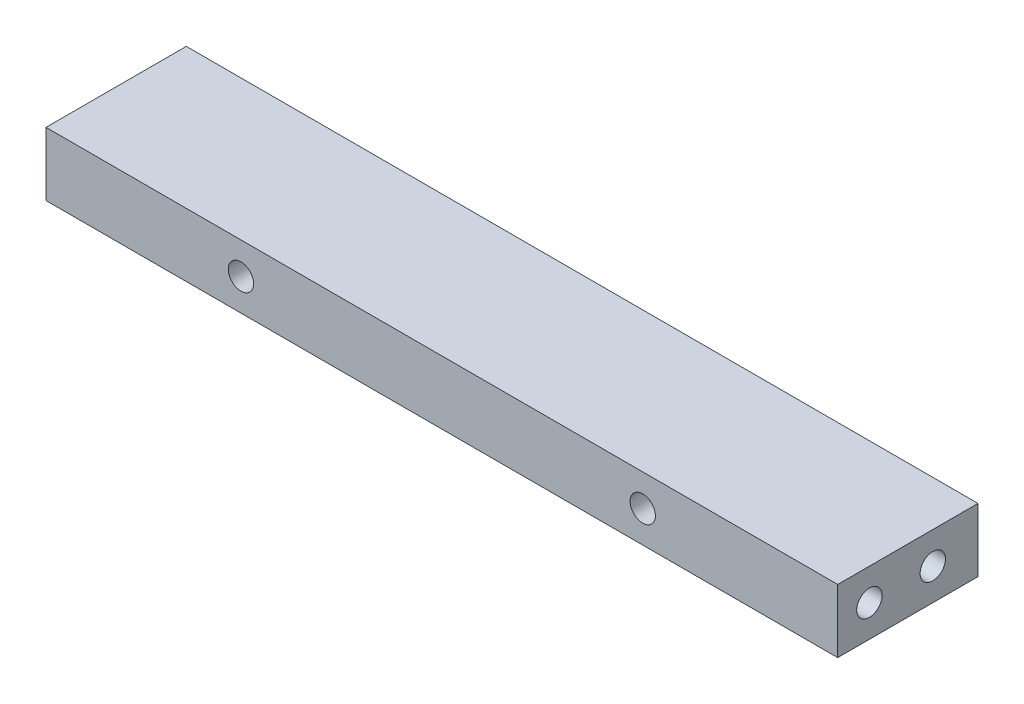
ISO-10303-21;
HEADER;
FILE_DESCRIPTION(('STEP AP214'),'2;1');
FILE_NAME('part.step','',(''),(''),'','','');
FILE_SCHEMA(('AUTOMOTIVE_DESIGN { 1 0 10303 214 1 1 1 1 }'));
ENDSEC;
DATA;
#1=APPLICATION_CONTEXT('core data for automotive mechanical design processes');
#2=APPLICATION_PROTOCOL_DEFINITION('international standard','automotive_design',2000,#1);
#3=PRODUCT_CONTEXT('',#1,'mechanical');
#4=PRODUCT('Part','Part','',(#3));
#5=PRODUCT_RELATED_PRODUCT_CATEGORY('part','',(#4));
#6=PRODUCT_DEFINITION_FORMATION('','',#4);
#7=PRODUCT_DEFINITION_CONTEXT('part definition',#1,'design');
#8=PRODUCT_DEFINITION('design','',#6,#7);
#9=PRODUCT_DEFINITION_SHAPE('','',#8);
#10=(LENGTH_UNIT() NAMED_UNIT(*) SI_UNIT(.MILLI.,.METRE.));
#11=(NAMED_UNIT(*) PLANE_ANGLE_UNIT() SI_UNIT($,.RADIAN.));
#12=(NAMED_UNIT(*) SI_UNIT($,.STERADIAN.) SOLID_ANGLE_UNIT());
#13=UNCERTAINTY_MEASURE_WITH_UNIT(LENGTH_MEASURE(1.E-05),#10,'distance_accuracy_value','');
#14=(GEOMETRIC_REPRESENTATION_CONTEXT(3) GLOBAL_UNCERTAINTY_ASSIGNED_CONTEXT((#13)) GLOBAL_UNIT_ASSIGNED_CONTEXT((#10,
#11,#12)) REPRESENTATION_CONTEXT('',''));
#15=CARTESIAN_POINT('',(0.,0.,0.));
#16=DIRECTION('',(0.,0.,1.));
#17=DIRECTION('',(1.,0.,0.));
#18=AXIS2_PLACEMENT_3D('',#15,#16,#17);
#19=CARTESIAN_POINT('',(-0.3,-4.3,11.1));
#20=DIRECTION('',(1.,0.,0.));
#21=DIRECTION('',(0.,0.,-1.));
#22=AXIS2_PLACEMENT_3D('',#19,#20,#21);
#23=PLANE('',#22);
#24=CARTESIAN_POINT('',(-0.3,-2.3,5.1));
#25=DIRECTION('',(-1.,0.,0.));
#26=DIRECTION('',(0.,0.,1.));
#27=AXIS2_PLACEMENT_3D('',#24,#25,#26);
#28=CIRCLE('',#27,0.8);
#29=CARTESIAN_POINT('',(-0.3,-2.3,5.9));
#30=VERTEX_POINT('',#29);
#31=EDGE_CURVE('E165',#30,#30,#28,.T.);
#32=ORIENTED_EDGE('',*,*,#31,.F.);
#33=EDGE_LOOP('',(#32));
#34=FACE_BOUND('',#33,.T.);
#35=CARTESIAN_POINT('',(-0.3,-2.3,9.1));
#36=DIRECTION('',(-1.,0.,0.));
#37=DIRECTION('',(0.,0.,1.));
#38=AXIS2_PLACEMENT_3D('',#35,#36,#37);
#39=CIRCLE('',#38,0.8);
#40=CARTESIAN_POINT('',(-0.3,-2.3,9.9));
#41=VERTEX_POINT('',#40);
#42=EDGE_CURVE('E160',#41,#41,#39,.T.);
#43=ORIENTED_EDGE('',*,*,#42,.F.);
#44=EDGE_LOOP('',(#43));
#45=FACE_BOUND('',#44,.T.);
#46=DIRECTION('',(0.,-1.,0.));
#47=VECTOR('',#46,1.);
#48=CARTESIAN_POINT('',(-0.3,-4.3,2.248090434488));
#49=LINE('',#48,#47);
#50=CARTESIAN_POINT('',(-0.3,-0.3,2.248090434488));
#51=VERTEX_POINT('',#50);
#52=CARTESIAN_POINT('',(-0.3,-4.3,2.248090434488));
#53=VERTEX_POINT('',#52);
#54=EDGE_CURVE('E119',#51,#53,#49,.T.);
#55=ORIENTED_EDGE('',*,*,#54,.T.);
#56=DIRECTION('',(0.,0.,-1.));
#57=VECTOR('',#56,1.);
#58=CARTESIAN_POINT('',(-0.3,-4.3,11.1));
#59=LINE('',#58,#57);
#60=CARTESIAN_POINT('',(-0.3,-4.3,11.1));
#61=VERTEX_POINT('',#60);
#62=EDGE_CURVE('E11',#61,#53,#59,.T.);
#63=ORIENTED_EDGE('',*,*,#62,.F.);
#64=DIRECTION('',(0.,-1.,0.));
#65=VECTOR('',#64,1.);
#66=CARTESIAN_POINT('',(-0.3,-4.3,11.1));
#67=LINE('',#66,#65);
#68=CARTESIAN_POINT('',(-0.3,-0.3,11.1));
#69=VERTEX_POINT('',#68);
#70=EDGE_CURVE('E101',#69,#61,#67,.T.);
#71=ORIENTED_EDGE('',*,*,#70,.F.);
#72=DIRECTION('',(0.,0.,-1.));
#73=VECTOR('',#72,1.);
#74=CARTESIAN_POINT('',(-0.3,-0.3,11.1));
#75=LINE('',#74,#73);
#76=EDGE_CURVE('E115',#69,#51,#75,.T.);
#77=ORIENTED_EDGE('',*,*,#76,.T.);
#78=EDGE_LOOP('',(#55,#63,#71,#77));
#79=FACE_BOUND('',#78,.T.);
#80=ADVANCED_FACE('F49',(#34,#45,#79),#23,.F.);
#81=CARTESIAN_POINT('',(-0.3,-4.3,11.1));
#82=DIRECTION('',(0.,1.,0.));
#83=DIRECTION('',(0.,0.,1.));
#84=AXIS2_PLACEMENT_3D('',#81,#82,#83);
#85=PLANE('',#84);
#86=DIRECTION('',(1.,0.,0.));
#87=VECTOR('',#86,1.);
#88=CARTESIAN_POINT('',(-0.3,-4.3,2.248090434488));
#89=LINE('',#88,#87);
#90=CARTESIAN_POINT('',(49.65,-4.3,2.248090434488));
#91=VERTEX_POINT('',#90);
#92=EDGE_CURVE('E106',#53,#91,#89,.T.);
#93=ORIENTED_EDGE('',*,*,#92,.T.);
#94=DIRECTION('',(0.,0.,-1.));
#95=VECTOR('',#94,1.);
#96=CARTESIAN_POINT('',(49.65,-4.3,11.1));
#97=LINE('',#96,#95);
#98=CARTESIAN_POINT('',(49.65,-4.3,11.1));
#99=VERTEX_POINT('',#98);
#100=EDGE_CURVE('E58',#99,#91,#97,.T.);
#101=ORIENTED_EDGE('',*,*,#100,.F.);
#102=DIRECTION('',(1.,0.,0.));
#103=VECTOR('',#102,1.);
#104=CARTESIAN_POINT('',(-0.3,-4.3,11.1));
#105=LINE('',#104,#103);
#106=EDGE_CURVE('E96',#61,#99,#105,.T.);
#107=ORIENTED_EDGE('',*,*,#106,.F.);
#108=ORIENTED_EDGE('',*,*,#62,.T.);
#109=EDGE_LOOP('',(#93,#101,#107,#108));
#110=FACE_BOUND('',#109,.T.);
#111=ADVANCED_FACE('F105',(#110),#85,.F.);
#112=CARTESIAN_POINT('',(49.65,-4.3,11.1));
#113=DIRECTION('',(-1.,0.,0.));
#114=DIRECTION('',(0.,0.,1.));
#115=AXIS2_PLACEMENT_3D('',#112,#113,#114);
#116=PLANE('',#115);
#117=CARTESIAN_POINT('',(49.65,-2.3,5.1));
#118=DIRECTION('',(1.,0.,0.));
#119=DIRECTION('',(0.,0.,-1.));
#120=AXIS2_PLACEMENT_3D('',#117,#118,#119);
#121=CIRCLE('',#120,0.8);
#122=CARTESIAN_POINT('',(49.65,-2.3,4.3));
#123=VERTEX_POINT('',#122);
#124=EDGE_CURVE('E179',#123,#123,#121,.T.);
#125=ORIENTED_EDGE('',*,*,#124,.F.);
#126=EDGE_LOOP('',(#125));
#127=FACE_BOUND('',#126,.T.);
#128=CARTESIAN_POINT('',(49.65,-2.3,9.1));
#129=DIRECTION('',(1.,0.,0.));
#130=DIRECTION('',(0.,0.,-1.));
#131=AXIS2_PLACEMENT_3D('',#128,#129,#130);
#132=CIRCLE('',#131,0.8);
#133=CARTESIAN_POINT('',(49.65,-2.3,8.3));
#134=VERTEX_POINT('',#133);
#135=EDGE_CURVE('E176',#134,#134,#132,.T.);
#136=ORIENTED_EDGE('',*,*,#135,.F.);
#137=EDGE_LOOP('',(#136));
#138=FACE_BOUND('',#137,.T.);
#139=DIRECTION('',(0.,1.,0.));
#140=VECTOR('',#139,1.);
#141=CARTESIAN_POINT('',(49.65,-4.3,2.248090434488));
#142=LINE('',#141,#140);
#143=CARTESIAN_POINT('',(49.65,-0.3,2.248090434488));
#144=VERTEX_POINT('',#143);
#145=EDGE_CURVE('E83',#91,#144,#142,.T.);
#146=ORIENTED_EDGE('',*,*,#145,.T.);
#147=DIRECTION('',(0.,0.,-1.));
#148=VECTOR('',#147,1.);
#149=CARTESIAN_POINT('',(49.65,-0.3,11.1));
#150=LINE('',#149,#148);
#151=CARTESIAN_POINT('',(49.65,-0.3,11.1));
#152=VERTEX_POINT('',#151);
#153=EDGE_CURVE('E108',#152,#144,#150,.T.);
#154=ORIENTED_EDGE('',*,*,#153,.F.);
#155=DIRECTION('',(0.,1.,0.));
#156=VECTOR('',#155,1.);
#157=CARTESIAN_POINT('',(49.65,-4.3,11.1));
#158=LINE('',#157,#156);
#159=EDGE_CURVE('E99',#99,#152,#158,.T.);
#160=ORIENTED_EDGE('',*,*,#159,.F.);
#161=ORIENTED_EDGE('',*,*,#100,.T.);
#162=EDGE_LOOP('',(#146,#154,#160,#161));
#163=FACE_BOUND('',#162,.T.);
#164=ADVANCED_FACE('F109',(#127,#138,#163),#116,.F.);
#165=CARTESIAN_POINT('',(-0.3,-0.3,11.1));
#166=DIRECTION('',(0.,-1.,0.));
#167=DIRECTION('',(0.,0.,-1.));
#168=AXIS2_PLACEMENT_3D('',#165,#166,#167);
#169=PLANE('',#168);
#170=DIRECTION('',(-1.,0.,0.));
#171=VECTOR('',#170,1.);
#172=CARTESIAN_POINT('',(-0.3,-0.3,2.248090434488));
#173=LINE('',#172,#171);
#174=EDGE_CURVE('E89',#144,#51,#173,.T.);
#175=ORIENTED_EDGE('',*,*,#174,.T.);
#176=ORIENTED_EDGE('',*,*,#76,.F.);
#177=DIRECTION('',(-1.,0.,0.));
#178=VECTOR('',#177,1.);
#179=CARTESIAN_POINT('',(-0.3,-0.3,11.1));
#180=LINE('',#179,#178);
#181=EDGE_CURVE('E66',#152,#69,#180,.T.);
#182=ORIENTED_EDGE('',*,*,#181,.F.);
#183=ORIENTED_EDGE('',*,*,#153,.T.);
#184=EDGE_LOOP('',(#175,#176,#182,#183));
#185=FACE_BOUND('',#184,.T.);
#186=ADVANCED_FACE('F133',(#185),#169,.F.);
#187=CARTESIAN_POINT('',(0.,0.,11.1));
#188=DIRECTION('',(0.,0.,-1.));
#189=DIRECTION('',(-1.,0.,0.));
#190=AXIS2_PLACEMENT_3D('',#187,#188,#189);
#191=PLANE('',#190);
#192=CARTESIAN_POINT('',(12.,-2.3,11.1));
#193=DIRECTION('',(0.,0.,1.));
#194=DIRECTION('',(1.,0.,0.));
#195=AXIS2_PLACEMENT_3D('',#192,#193,#194);
#196=CIRCLE('',#195,0.8);
#197=CARTESIAN_POINT('',(12.8,-2.3,11.1));
#198=VERTEX_POINT('',#197);
#199=EDGE_CURVE('E150',#198,#198,#196,.T.);
#200=ORIENTED_EDGE('',*,*,#199,.F.);
#201=EDGE_LOOP('',(#200));
#202=FACE_BOUND('',#201,.T.);
#203=CARTESIAN_POINT('',(37.35,-2.3,11.1));
#204=DIRECTION('',(0.,0.,1.));
#205=DIRECTION('',(1.,0.,0.));
#206=AXIS2_PLACEMENT_3D('',#203,#204,#205);
#207=CIRCLE('',#206,0.800000000000002);
#208=CARTESIAN_POINT('',(38.15,-2.3,11.1));
#209=VERTEX_POINT('',#208);
#210=EDGE_CURVE('E145',#209,#209,#207,.T.);
#211=ORIENTED_EDGE('',*,*,#210,.F.);
#212=EDGE_LOOP('',(#211));
#213=FACE_BOUND('',#212,.T.);
#214=ORIENTED_EDGE('',*,*,#70,.T.);
#215=ORIENTED_EDGE('',*,*,#106,.T.);
#216=ORIENTED_EDGE('',*,*,#159,.T.);
#217=ORIENTED_EDGE('',*,*,#181,.T.);
#218=EDGE_LOOP('',(#214,#215,#216,#217));
#219=FACE_BOUND('',#218,.T.);
#220=ADVANCED_FACE('F97',(#202,#213,#219),#191,.F.);
#221=CARTESIAN_POINT('',(0.,0.,2.248090434488));
#222=DIRECTION('',(0.,0.,-1.));
#223=DIRECTION('',(-1.,0.,0.));
#224=AXIS2_PLACEMENT_3D('',#221,#222,#223);
#225=PLANE('',#224);
#226=CARTESIAN_POINT('',(12.,-2.3,2.248090434488));
#227=DIRECTION('',(0.,0.,1.));
#228=DIRECTION('',(1.,0.,0.));
#229=AXIS2_PLACEMENT_3D('',#226,#227,#228);
#230=CIRCLE('',#229,0.8);
#231=CARTESIAN_POINT('',(12.8,-2.3,2.248090434488));
#232=VERTEX_POINT('',#231);
#233=EDGE_CURVE('E123',#232,#232,#230,.T.);
#234=ORIENTED_EDGE('',*,*,#233,.T.);
#235=EDGE_LOOP('',(#234));
#236=FACE_BOUND('',#235,.T.);
#237=CARTESIAN_POINT('',(37.35,-2.3,2.248090434488));
#238=DIRECTION('',(0.,0.,1.));
#239=DIRECTION('',(1.,0.,0.));
#240=AXIS2_PLACEMENT_3D('',#237,#238,#239);
#241=CIRCLE('',#240,0.800000000000002);
#242=CARTESIAN_POINT('',(38.15,-2.3,2.248090434488));
#243=VERTEX_POINT('',#242);
#244=EDGE_CURVE('E141',#243,#243,#241,.T.);
#245=ORIENTED_EDGE('',*,*,#244,.T.);
#246=EDGE_LOOP('',(#245));
#247=FACE_BOUND('',#246,.T.);
#248=ORIENTED_EDGE('',*,*,#54,.F.);
#249=ORIENTED_EDGE('',*,*,#174,.F.);
#250=ORIENTED_EDGE('',*,*,#145,.F.);
#251=ORIENTED_EDGE('',*,*,#92,.F.);
#252=EDGE_LOOP('',(#248,#249,#250,#251));
#253=FACE_BOUND('',#252,.T.);
#254=ADVANCED_FACE('F136',(#236,#247,#253),#225,.T.);
#255=CARTESIAN_POINT('',(37.35,-2.3,2.248090434488));
#256=DIRECTION('',(0.,0.,1.));
#257=DIRECTION('',(1.,0.,0.));
#258=AXIS2_PLACEMENT_3D('',#255,#256,#257);
#259=CYLINDRICAL_SURFACE('',#258,0.800000000000002);
#260=ORIENTED_EDGE('',*,*,#244,.F.);
#261=EDGE_LOOP('',(#260));
#262=FACE_BOUND('',#261,.T.);
#263=ORIENTED_EDGE('',*,*,#210,.T.);
#264=EDGE_LOOP('',(#263));
#265=FACE_BOUND('',#264,.T.);
#266=ADVANCED_FACE('F233',(#262,#265),#259,.F.);
#267=CARTESIAN_POINT('',(12.,-2.3,2.248090434488));
#268=DIRECTION('',(0.,0.,1.));
#269=DIRECTION('',(1.,0.,0.));
#270=AXIS2_PLACEMENT_3D('',#267,#268,#269);
#271=CYLINDRICAL_SURFACE('',#270,0.8);
#272=ORIENTED_EDGE('',*,*,#233,.F.);
#273=EDGE_LOOP('',(#272));
#274=FACE_BOUND('',#273,.T.);
#275=ORIENTED_EDGE('',*,*,#199,.T.);
#276=EDGE_LOOP('',(#275));
#277=FACE_BOUND('',#276,.T.);
#278=ADVANCED_FACE('F225',(#274,#277),#271,.F.);
#279=CARTESIAN_POINT('',(4.7,-2.3,9.1));
#280=DIRECTION('',(-1.,0.,0.));
#281=DIRECTION('',(0.,0.,1.));
#282=AXIS2_PLACEMENT_3D('',#279,#280,#281);
#283=CYLINDRICAL_SURFACE('',#282,0.8);
#284=CARTESIAN_POINT('',(4.7,-2.3,9.1));
#285=DIRECTION('',(-1.,0.,0.));
#286=DIRECTION('',(0.,0.,1.));
#287=AXIS2_PLACEMENT_3D('',#284,#285,#286);
#288=CIRCLE('',#287,0.8);
#289=CARTESIAN_POINT('',(4.7,-2.3,9.9));
#290=VERTEX_POINT('',#289);
#291=EDGE_CURVE('E156',#290,#290,#288,.T.);
#292=ORIENTED_EDGE('',*,*,#291,.F.);
#293=EDGE_LOOP('',(#292));
#294=FACE_BOUND('',#293,.T.);
#295=ORIENTED_EDGE('',*,*,#42,.T.);
#296=EDGE_LOOP('',(#295));
#297=FACE_BOUND('',#296,.T.);
#298=ADVANCED_FACE('F222',(#294,#297),#283,.F.);
#299=CARTESIAN_POINT('',(4.7,-2.3,9.1));
#300=DIRECTION('',(-1.,0.,0.));
#301=DIRECTION('',(0.,0.,1.));
#302=AXIS2_PLACEMENT_3D('',#299,#300,#301);
#303=PLANE('',#302);
#304=ORIENTED_EDGE('',*,*,#291,.T.);
#305=EDGE_LOOP('',(#304));
#306=FACE_BOUND('',#305,.T.);
#307=ADVANCED_FACE('F224',(#306),#303,.T.);
#308=CARTESIAN_POINT('',(4.7,-2.3,5.1));
#309=DIRECTION('',(-1.,0.,0.));
#310=DIRECTION('',(0.,0.,1.));
#311=AXIS2_PLACEMENT_3D('',#308,#309,#310);
#312=CYLINDRICAL_SURFACE('',#311,0.8);
#313=CARTESIAN_POINT('',(4.7,-2.3,5.1));
#314=DIRECTION('',(-1.,0.,0.));
#315=DIRECTION('',(0.,0.,1.));
#316=AXIS2_PLACEMENT_3D('',#313,#314,#315);
#317=CIRCLE('',#316,0.8);
#318=CARTESIAN_POINT('',(4.7,-2.3,5.9));
#319=VERTEX_POINT('',#318);
#320=EDGE_CURVE('E146',#319,#319,#317,.T.);
#321=ORIENTED_EDGE('',*,*,#320,.F.);
#322=EDGE_LOOP('',(#321));
#323=FACE_BOUND('',#322,.T.);
#324=ORIENTED_EDGE('',*,*,#31,.T.);
#325=EDGE_LOOP('',(#324));
#326=FACE_BOUND('',#325,.T.);
#327=ADVANCED_FACE('F210',(#323,#326),#312,.F.);
#328=CARTESIAN_POINT('',(4.7,-2.3,5.1));
#329=DIRECTION('',(-1.,0.,0.));
#330=DIRECTION('',(0.,0.,1.));
#331=AXIS2_PLACEMENT_3D('',#328,#329,#330);
#332=PLANE('',#331);
#333=ORIENTED_EDGE('',*,*,#320,.T.);
#334=EDGE_LOOP('',(#333));
#335=FACE_BOUND('',#334,.T.);
#336=ADVANCED_FACE('F202',(#335),#332,.T.);
#337=CARTESIAN_POINT('',(44.65,-2.3,9.1));
#338=DIRECTION('',(1.,0.,0.));
#339=DIRECTION('',(0.,0.,-1.));
#340=AXIS2_PLACEMENT_3D('',#337,#338,#339);
#341=CYLINDRICAL_SURFACE('',#340,0.8);
#342=CARTESIAN_POINT('',(44.65,-2.3,9.1));
#343=DIRECTION('',(1.,0.,0.));
#344=DIRECTION('',(0.,0.,-1.));
#345=AXIS2_PLACEMENT_3D('',#342,#343,#344);
#346=CIRCLE('',#345,0.8);
#347=CARTESIAN_POINT('',(44.65,-2.3,8.3));
#348=VERTEX_POINT('',#347);
#349=EDGE_CURVE('E172',#348,#348,#346,.T.);
#350=ORIENTED_EDGE('',*,*,#349,.F.);
#351=EDGE_LOOP('',(#350));
#352=FACE_BOUND('',#351,.T.);
#353=ORIENTED_EDGE('',*,*,#135,.T.);
#354=EDGE_LOOP('',(#353));
#355=FACE_BOUND('',#354,.T.);
#356=ADVANCED_FACE('F200',(#352,#355),#341,.F.);
#357=CARTESIAN_POINT('',(44.65,-2.3,9.1));
#358=DIRECTION('',(1.,0.,0.));
#359=DIRECTION('',(0.,0.,-1.));
#360=AXIS2_PLACEMENT_3D('',#357,#358,#359);
#361=PLANE('',#360);
#362=ORIENTED_EDGE('',*,*,#349,.T.);
#363=EDGE_LOOP('',(#362));
#364=FACE_BOUND('',#363,.T.);
#365=ADVANCED_FACE('F191',(#364),#361,.T.);
#366=CARTESIAN_POINT('',(44.65,-2.3,5.1));
#367=DIRECTION('',(1.,0.,0.));
#368=DIRECTION('',(0.,0.,-1.));
#369=AXIS2_PLACEMENT_3D('',#366,#367,#368);
#370=CYLINDRICAL_SURFACE('',#369,0.8);
#371=CARTESIAN_POINT('',(44.65,-2.3,5.1));
#372=DIRECTION('',(1.,0.,0.));
#373=DIRECTION('',(0.,0.,-1.));
#374=AXIS2_PLACEMENT_3D('',#371,#372,#373);
#375=CIRCLE('',#374,0.8);
#376=CARTESIAN_POINT('',(44.65,-2.3,4.3));
#377=VERTEX_POINT('',#376);
#378=EDGE_CURVE('E161',#377,#377,#375,.T.);
#379=ORIENTED_EDGE('',*,*,#378,.F.);
#380=EDGE_LOOP('',(#379));
#381=FACE_BOUND('',#380,.T.);
#382=ORIENTED_EDGE('',*,*,#124,.T.);
#383=EDGE_LOOP('',(#382));
#384=FACE_BOUND('',#383,.T.);
#385=ADVANCED_FACE('F188',(#381,#384),#370,.F.);
#386=CARTESIAN_POINT('',(44.65,-2.3,5.1));
#387=DIRECTION('',(1.,0.,0.));
#388=DIRECTION('',(0.,0.,-1.));
#389=AXIS2_PLACEMENT_3D('',#386,#387,#388);
#390=PLANE('',#389);
#391=ORIENTED_EDGE('',*,*,#378,.T.);
#392=EDGE_LOOP('',(#391));
#393=FACE_BOUND('',#392,.T.);
#394=ADVANCED_FACE('F186',(#393),#390,.T.);
#395=CLOSED_SHELL('',(#80,#111,#164,#186,#220,#254,#266,#278,#298,#307,#327,#336,#356,#365,#385,#394));
#396=MANIFOLD_SOLID_BREP('B2',#395);
#397=ADVANCED_BREP_SHAPE_REPRESENTATION('',(#18,#396),#14);
#398=SHAPE_DEFINITION_REPRESENTATION(#9,#397);
ENDSEC;
END-ISO-10303-21;
